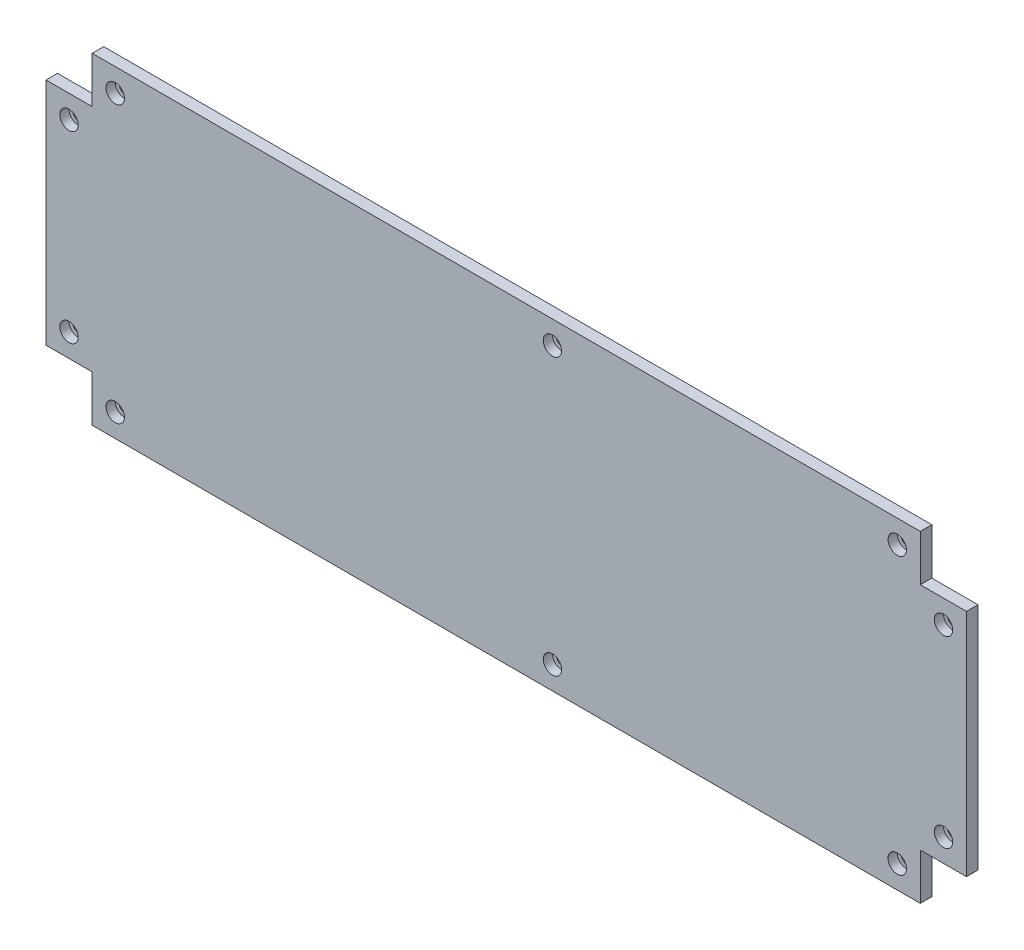
ISO-10303-21;
HEADER;
FILE_DESCRIPTION(('STEP AP214'),'2;1');
FILE_NAME('part.step','',(''),(''),'','','');
FILE_SCHEMA(('AUTOMOTIVE_DESIGN { 1 0 10303 214 1 1 1 1 }'));
ENDSEC;
DATA;
#1=APPLICATION_CONTEXT('core data for automotive mechanical design processes');
#2=APPLICATION_PROTOCOL_DEFINITION('international standard','automotive_design',2000,#1);
#3=PRODUCT_CONTEXT('',#1,'mechanical');
#4=PRODUCT('Part','Part','',(#3));
#5=PRODUCT_RELATED_PRODUCT_CATEGORY('part','',(#4));
#6=PRODUCT_DEFINITION_FORMATION('','',#4);
#7=PRODUCT_DEFINITION_CONTEXT('part definition',#1,'design');
#8=PRODUCT_DEFINITION('design','',#6,#7);
#9=PRODUCT_DEFINITION_SHAPE('','',#8);
#10=(LENGTH_UNIT() NAMED_UNIT(*) SI_UNIT(.MILLI.,.METRE.));
#11=(NAMED_UNIT(*) PLANE_ANGLE_UNIT() SI_UNIT($,.RADIAN.));
#12=(NAMED_UNIT(*) SI_UNIT($,.STERADIAN.) SOLID_ANGLE_UNIT());
#13=UNCERTAINTY_MEASURE_WITH_UNIT(LENGTH_MEASURE(1.E-05),#10,'distance_accuracy_value','');
#14=(GEOMETRIC_REPRESENTATION_CONTEXT(3) GLOBAL_UNCERTAINTY_ASSIGNED_CONTEXT((#13)) GLOBAL_UNIT_ASSIGNED_CONTEXT((#10,
#11,#12)) REPRESENTATION_CONTEXT('',''));
#15=CARTESIAN_POINT('',(0.,0.,0.));
#16=DIRECTION('',(0.,0.,1.));
#17=DIRECTION('',(1.,0.,0.));
#18=AXIS2_PLACEMENT_3D('',#15,#16,#17);
#19=CARTESIAN_POINT('',(-20.08,-99.84,5.));
#20=DIRECTION('',(1.,0.,0.));
#21=DIRECTION('',(0.,0.,-1.));
#22=AXIS2_PLACEMENT_3D('',#19,#20,#21);
#23=PLANE('',#22);
#24=DIRECTION('',(0.,-1.,0.));
#25=VECTOR('',#24,1.);
#26=CARTESIAN_POINT('',(-20.08,-99.84,0.));
#27=LINE('',#26,#25);
#28=CARTESIAN_POINT('',(-20.08,0.,0.));
#29=VERTEX_POINT('',#28);
#30=CARTESIAN_POINT('',(-20.08,-99.84,0.));
#31=VERTEX_POINT('',#30);
#32=EDGE_CURVE('E168',#29,#31,#27,.T.);
#33=ORIENTED_EDGE('',*,*,#32,.T.);
#34=DIRECTION('',(0.,0.,-1.));
#35=VECTOR('',#34,1.);
#36=CARTESIAN_POINT('',(-20.08,-99.84,5.));
#37=LINE('',#36,#35);
#38=CARTESIAN_POINT('',(-20.08,-99.84,5.));
#39=VERTEX_POINT('',#38);
#40=EDGE_CURVE('E11',#39,#31,#37,.T.);
#41=ORIENTED_EDGE('',*,*,#40,.F.);
#42=DIRECTION('',(0.,-1.,0.));
#43=VECTOR('',#42,1.);
#44=CARTESIAN_POINT('',(-20.08,-99.84,5.));
#45=LINE('',#44,#43);
#46=CARTESIAN_POINT('',(-20.08,0.,5.));
#47=VERTEX_POINT('',#46);
#48=EDGE_CURVE('E203',#47,#39,#45,.T.);
#49=ORIENTED_EDGE('',*,*,#48,.F.);
#50=DIRECTION('',(0.,0.,-1.));
#51=VECTOR('',#50,1.);
#52=CARTESIAN_POINT('',(-20.08,0.,5.));
#53=LINE('',#52,#51);
#54=EDGE_CURVE('E164',#47,#29,#53,.T.);
#55=ORIENTED_EDGE('',*,*,#54,.T.);
#56=EDGE_LOOP('',(#33,#41,#49,#55));
#57=FACE_BOUND('',#56,.T.);
#58=ADVANCED_FACE('F43',(#57),#23,.F.);
#59=CARTESIAN_POINT('',(0.,-99.84,5.));
#60=DIRECTION('',(0.,1.,0.));
#61=DIRECTION('',(0.,0.,1.));
#62=AXIS2_PLACEMENT_3D('',#59,#60,#61);
#63=PLANE('',#62);
#64=DIRECTION('',(1.,0.,0.));
#65=VECTOR('',#64,1.);
#66=CARTESIAN_POINT('',(0.,-99.84,0.));
#67=LINE('',#66,#65);
#68=CARTESIAN_POINT('',(0.,-99.84,0.));
#69=VERTEX_POINT('',#68);
#70=EDGE_CURVE('E172',#31,#69,#67,.T.);
#71=ORIENTED_EDGE('',*,*,#70,.T.);
#72=DIRECTION('',(0.,0.,-1.));
#73=VECTOR('',#72,1.);
#74=CARTESIAN_POINT('',(0.,-99.84,5.));
#75=LINE('',#74,#73);
#76=CARTESIAN_POINT('',(0.,-99.84,5.));
#77=VERTEX_POINT('',#76);
#78=EDGE_CURVE('E52',#77,#69,#75,.T.);
#79=ORIENTED_EDGE('',*,*,#78,.F.);
#80=DIRECTION('',(1.,0.,0.));
#81=VECTOR('',#80,1.);
#82=CARTESIAN_POINT('',(0.,-99.84,5.));
#83=LINE('',#82,#81);
#84=EDGE_CURVE('E115',#39,#77,#83,.T.);
#85=ORIENTED_EDGE('',*,*,#84,.F.);
#86=ORIENTED_EDGE('',*,*,#40,.T.);
#87=EDGE_LOOP('',(#71,#79,#85,#86));
#88=FACE_BOUND('',#87,.T.);
#89=ADVANCED_FACE('F298',(#88),#63,.F.);
#90=CARTESIAN_POINT('',(0.,-119.92,5.));
#91=DIRECTION('',(1.,0.,0.));
#92=DIRECTION('',(0.,1.,0.));
#93=AXIS2_PLACEMENT_3D('',#90,#91,#92);
#94=PLANE('',#93);
#95=DIRECTION('',(0.,-1.,0.));
#96=VECTOR('',#95,1.);
#97=CARTESIAN_POINT('',(0.,-119.92,0.));
#98=LINE('',#97,#96);
#99=CARTESIAN_POINT('',(0.,-119.92,0.));
#100=VERTEX_POINT('',#99);
#101=EDGE_CURVE('E176',#69,#100,#98,.T.);
#102=ORIENTED_EDGE('',*,*,#101,.T.);
#103=DIRECTION('',(0.,0.,-1.));
#104=VECTOR('',#103,1.);
#105=CARTESIAN_POINT('',(0.,-119.92,5.));
#106=LINE('',#105,#104);
#107=CARTESIAN_POINT('',(0.,-119.92,5.));
#108=VERTEX_POINT('',#107);
#109=EDGE_CURVE('E230',#108,#100,#106,.T.);
#110=ORIENTED_EDGE('',*,*,#109,.F.);
#111=DIRECTION('',(0.,-1.,0.));
#112=VECTOR('',#111,1.);
#113=CARTESIAN_POINT('',(0.,-119.92,5.));
#114=LINE('',#113,#112);
#115=EDGE_CURVE('E240',#77,#108,#114,.T.);
#116=ORIENTED_EDGE('',*,*,#115,.F.);
#117=ORIENTED_EDGE('',*,*,#78,.T.);
#118=EDGE_LOOP('',(#102,#110,#116,#117));
#119=FACE_BOUND('',#118,.T.);
#120=ADVANCED_FACE('F238',(#119),#94,.F.);
#121=CARTESIAN_POINT('',(359.84,-119.92,5.));
#122=DIRECTION('',(0.,1.,0.));
#123=DIRECTION('',(-1.,0.,0.));
#124=AXIS2_PLACEMENT_3D('',#121,#122,#123);
#125=PLANE('',#124);
#126=DIRECTION('',(1.,0.,0.));
#127=VECTOR('',#126,1.);
#128=CARTESIAN_POINT('',(359.84,-119.92,0.));
#129=LINE('',#128,#127);
#130=CARTESIAN_POINT('',(359.84,-119.92,0.));
#131=VERTEX_POINT('',#130);
#132=EDGE_CURVE('E179',#100,#131,#129,.T.);
#133=ORIENTED_EDGE('',*,*,#132,.T.);
#134=DIRECTION('',(0.,0.,-1.));
#135=VECTOR('',#134,1.);
#136=CARTESIAN_POINT('',(359.84,-119.92,5.));
#137=LINE('',#136,#135);
#138=CARTESIAN_POINT('',(359.84,-119.92,5.));
#139=VERTEX_POINT('',#138);
#140=EDGE_CURVE('E226',#139,#131,#137,.T.);
#141=ORIENTED_EDGE('',*,*,#140,.F.);
#142=DIRECTION('',(1.,0.,0.));
#143=VECTOR('',#142,1.);
#144=CARTESIAN_POINT('',(359.84,-119.92,5.));
#145=LINE('',#144,#143);
#146=EDGE_CURVE('E259',#108,#139,#145,.T.);
#147=ORIENTED_EDGE('',*,*,#146,.F.);
#148=ORIENTED_EDGE('',*,*,#109,.T.);
#149=EDGE_LOOP('',(#133,#141,#147,#148));
#150=FACE_BOUND('',#149,.T.);
#151=ADVANCED_FACE('F249',(#150),#125,.F.);
#152=CARTESIAN_POINT('',(359.84,-99.84,5.));
#153=DIRECTION('',(-1.,0.,0.));
#154=DIRECTION('',(0.,-1.,0.));
#155=AXIS2_PLACEMENT_3D('',#152,#153,#154);
#156=PLANE('',#155);
#157=DIRECTION('',(0.,1.,0.));
#158=VECTOR('',#157,1.);
#159=CARTESIAN_POINT('',(359.84,-99.84,0.));
#160=LINE('',#159,#158);
#161=CARTESIAN_POINT('',(359.84,-99.84,0.));
#162=VERTEX_POINT('',#161);
#163=EDGE_CURVE('E182',#131,#162,#160,.T.);
#164=ORIENTED_EDGE('',*,*,#163,.T.);
#165=DIRECTION('',(0.,0.,-1.));
#166=VECTOR('',#165,1.);
#167=CARTESIAN_POINT('',(359.84,-99.84,5.));
#168=LINE('',#167,#166);
#169=CARTESIAN_POINT('',(359.84,-99.84,5.));
#170=VERTEX_POINT('',#169);
#171=EDGE_CURVE('E222',#170,#162,#168,.T.);
#172=ORIENTED_EDGE('',*,*,#171,.F.);
#173=DIRECTION('',(0.,1.,0.));
#174=VECTOR('',#173,1.);
#175=CARTESIAN_POINT('',(359.84,-99.84,5.));
#176=LINE('',#175,#174);
#177=EDGE_CURVE('E255',#139,#170,#176,.T.);
#178=ORIENTED_EDGE('',*,*,#177,.F.);
#179=ORIENTED_EDGE('',*,*,#140,.T.);
#180=EDGE_LOOP('',(#164,#172,#178,#179));
#181=FACE_BOUND('',#180,.T.);
#182=ADVANCED_FACE('F253',(#181),#156,.F.);
#183=CARTESIAN_POINT('',(379.92,-99.84,5.));
#184=DIRECTION('',(0.,1.,0.));
#185=DIRECTION('',(0.,0.,1.));
#186=AXIS2_PLACEMENT_3D('',#183,#184,#185);
#187=PLANE('',#186);
#188=DIRECTION('',(1.,0.,0.));
#189=VECTOR('',#188,1.);
#190=CARTESIAN_POINT('',(379.92,-99.84,0.));
#191=LINE('',#190,#189);
#192=CARTESIAN_POINT('',(379.92,-99.84,0.));
#193=VERTEX_POINT('',#192);
#194=EDGE_CURVE('E185',#162,#193,#191,.T.);
#195=ORIENTED_EDGE('',*,*,#194,.T.);
#196=DIRECTION('',(0.,0.,-1.));
#197=VECTOR('',#196,1.);
#198=CARTESIAN_POINT('',(379.92,-99.84,5.));
#199=LINE('',#198,#197);
#200=CARTESIAN_POINT('',(379.92,-99.84,5.));
#201=VERTEX_POINT('',#200);
#202=EDGE_CURVE('E218',#201,#193,#199,.T.);
#203=ORIENTED_EDGE('',*,*,#202,.F.);
#204=DIRECTION('',(1.,0.,0.));
#205=VECTOR('',#204,1.);
#206=CARTESIAN_POINT('',(379.92,-99.84,5.));
#207=LINE('',#206,#205);
#208=EDGE_CURVE('E258',#170,#201,#207,.T.);
#209=ORIENTED_EDGE('',*,*,#208,.F.);
#210=ORIENTED_EDGE('',*,*,#171,.T.);
#211=EDGE_LOOP('',(#195,#203,#209,#210));
#212=FACE_BOUND('',#211,.T.);
#213=ADVANCED_FACE('F311',(#212),#187,.F.);
#214=CARTESIAN_POINT('',(379.92,0.,5.));
#215=DIRECTION('',(-1.,0.,0.));
#216=DIRECTION('',(0.,0.,1.));
#217=AXIS2_PLACEMENT_3D('',#214,#215,#216);
#218=PLANE('',#217);
#219=DIRECTION('',(0.,1.,0.));
#220=VECTOR('',#219,1.);
#221=CARTESIAN_POINT('',(379.92,0.,0.));
#222=LINE('',#221,#220);
#223=CARTESIAN_POINT('',(379.92,0.,0.));
#224=VERTEX_POINT('',#223);
#225=EDGE_CURVE('E188',#193,#224,#222,.T.);
#226=ORIENTED_EDGE('',*,*,#225,.T.);
#227=DIRECTION('',(0.,0.,-1.));
#228=VECTOR('',#227,1.);
#229=CARTESIAN_POINT('',(379.92,0.,5.));
#230=LINE('',#229,#228);
#231=CARTESIAN_POINT('',(379.92,0.,5.));
#232=VERTEX_POINT('',#231);
#233=EDGE_CURVE('E214',#232,#224,#230,.T.);
#234=ORIENTED_EDGE('',*,*,#233,.F.);
#235=DIRECTION('',(0.,1.,0.));
#236=VECTOR('',#235,1.);
#237=CARTESIAN_POINT('',(379.92,0.,5.));
#238=LINE('',#237,#236);
#239=EDGE_CURVE('E263',#201,#232,#238,.T.);
#240=ORIENTED_EDGE('',*,*,#239,.F.);
#241=ORIENTED_EDGE('',*,*,#202,.T.);
#242=EDGE_LOOP('',(#226,#234,#240,#241));
#243=FACE_BOUND('',#242,.T.);
#244=ADVANCED_FACE('F314',(#243),#218,.F.);
#245=CARTESIAN_POINT('',(359.84,0.,5.));
#246=DIRECTION('',(0.,-1.,0.));
#247=DIRECTION('',(0.,0.,-1.));
#248=AXIS2_PLACEMENT_3D('',#245,#246,#247);
#249=PLANE('',#248);
#250=DIRECTION('',(-1.,0.,0.));
#251=VECTOR('',#250,1.);
#252=CARTESIAN_POINT('',(359.84,0.,0.));
#253=LINE('',#252,#251);
#254=CARTESIAN_POINT('',(359.84,0.,0.));
#255=VERTEX_POINT('',#254);
#256=EDGE_CURVE('E191',#224,#255,#253,.T.);
#257=ORIENTED_EDGE('',*,*,#256,.T.);
#258=DIRECTION('',(0.,0.,-1.));
#259=VECTOR('',#258,1.);
#260=CARTESIAN_POINT('',(359.84,0.,5.));
#261=LINE('',#260,#259);
#262=CARTESIAN_POINT('',(359.84,0.,5.));
#263=VERTEX_POINT('',#262);
#264=EDGE_CURVE('E210',#263,#255,#261,.T.);
#265=ORIENTED_EDGE('',*,*,#264,.F.);
#266=DIRECTION('',(-1.,0.,0.));
#267=VECTOR('',#266,1.);
#268=CARTESIAN_POINT('',(359.84,0.,5.));
#269=LINE('',#268,#267);
#270=EDGE_CURVE('E270',#232,#263,#269,.T.);
#271=ORIENTED_EDGE('',*,*,#270,.F.);
#272=ORIENTED_EDGE('',*,*,#233,.T.);
#273=EDGE_LOOP('',(#257,#265,#271,#272));
#274=FACE_BOUND('',#273,.T.);
#275=ADVANCED_FACE('F278',(#274),#249,.F.);
#276=CARTESIAN_POINT('',(359.84,20.08,5.));
#277=DIRECTION('',(-1.,0.,0.));
#278=DIRECTION('',(0.,0.,1.));
#279=AXIS2_PLACEMENT_3D('',#276,#277,#278);
#280=PLANE('',#279);
#281=DIRECTION('',(0.,1.,0.));
#282=VECTOR('',#281,1.);
#283=CARTESIAN_POINT('',(359.84,20.08,0.));
#284=LINE('',#283,#282);
#285=CARTESIAN_POINT('',(359.84,20.08,0.));
#286=VERTEX_POINT('',#285);
#287=EDGE_CURVE('E194',#255,#286,#284,.T.);
#288=ORIENTED_EDGE('',*,*,#287,.T.);
#289=DIRECTION('',(0.,0.,-1.));
#290=VECTOR('',#289,1.);
#291=CARTESIAN_POINT('',(359.84,20.08,5.));
#292=LINE('',#291,#290);
#293=CARTESIAN_POINT('',(359.84,20.08,5.));
#294=VERTEX_POINT('',#293);
#295=EDGE_CURVE('E157',#294,#286,#292,.T.);
#296=ORIENTED_EDGE('',*,*,#295,.F.);
#297=DIRECTION('',(0.,1.,0.));
#298=VECTOR('',#297,1.);
#299=CARTESIAN_POINT('',(359.84,20.08,5.));
#300=LINE('',#299,#298);
#301=EDGE_CURVE('E146',#263,#294,#300,.T.);
#302=ORIENTED_EDGE('',*,*,#301,.F.);
#303=ORIENTED_EDGE('',*,*,#264,.T.);
#304=EDGE_LOOP('',(#288,#296,#302,#303));
#305=FACE_BOUND('',#304,.T.);
#306=ADVANCED_FACE('F282',(#305),#280,.F.);
#307=CARTESIAN_POINT('',(0.,20.08,5.));
#308=DIRECTION('',(0.,-1.,0.));
#309=DIRECTION('',(0.,0.,-1.));
#310=AXIS2_PLACEMENT_3D('',#307,#308,#309);
#311=PLANE('',#310);
#312=DIRECTION('',(-1.,0.,0.));
#313=VECTOR('',#312,1.);
#314=CARTESIAN_POINT('',(0.,20.08,0.));
#315=LINE('',#314,#313);
#316=CARTESIAN_POINT('',(0.,20.08,0.));
#317=VERTEX_POINT('',#316);
#318=EDGE_CURVE('E155',#286,#317,#315,.T.);
#319=ORIENTED_EDGE('',*,*,#318,.T.);
#320=DIRECTION('',(0.,0.,-1.));
#321=VECTOR('',#320,1.);
#322=CARTESIAN_POINT('',(0.,20.08,5.));
#323=LINE('',#322,#321);
#324=CARTESIAN_POINT('',(0.,20.08,5.));
#325=VERTEX_POINT('',#324);
#326=EDGE_CURVE('E152',#325,#317,#323,.T.);
#327=ORIENTED_EDGE('',*,*,#326,.F.);
#328=DIRECTION('',(-1.,0.,0.));
#329=VECTOR('',#328,1.);
#330=CARTESIAN_POINT('',(0.,20.08,5.));
#331=LINE('',#330,#329);
#332=EDGE_CURVE('E140',#294,#325,#331,.T.);
#333=ORIENTED_EDGE('',*,*,#332,.F.);
#334=ORIENTED_EDGE('',*,*,#295,.T.);
#335=EDGE_LOOP('',(#319,#327,#333,#334));
#336=FACE_BOUND('',#335,.T.);
#337=ADVANCED_FACE('F153',(#336),#311,.F.);
#338=CARTESIAN_POINT('',(0.,0.,5.));
#339=DIRECTION('',(1.,0.,0.));
#340=DIRECTION('',(0.,0.,-1.));
#341=AXIS2_PLACEMENT_3D('',#338,#339,#340);
#342=PLANE('',#341);
#343=DIRECTION('',(0.,-1.,0.));
#344=VECTOR('',#343,1.);
#345=CARTESIAN_POINT('',(0.,0.,0.));
#346=LINE('',#345,#344);
#347=CARTESIAN_POINT('',(0.,0.,0.));
#348=VERTEX_POINT('',#347);
#349=EDGE_CURVE('E101',#317,#348,#346,.T.);
#350=ORIENTED_EDGE('',*,*,#349,.T.);
#351=DIRECTION('',(0.,0.,-1.));
#352=VECTOR('',#351,1.);
#353=CARTESIAN_POINT('',(0.,0.,5.));
#354=LINE('',#353,#352);
#355=CARTESIAN_POINT('',(0.,0.,5.));
#356=VERTEX_POINT('',#355);
#357=EDGE_CURVE('E158',#356,#348,#354,.T.);
#358=ORIENTED_EDGE('',*,*,#357,.F.);
#359=DIRECTION('',(0.,-1.,0.));
#360=VECTOR('',#359,1.);
#361=CARTESIAN_POINT('',(0.,0.,5.));
#362=LINE('',#361,#360);
#363=EDGE_CURVE('E144',#325,#356,#362,.T.);
#364=ORIENTED_EDGE('',*,*,#363,.F.);
#365=ORIENTED_EDGE('',*,*,#326,.T.);
#366=EDGE_LOOP('',(#350,#358,#364,#365));
#367=FACE_BOUND('',#366,.T.);
#368=ADVANCED_FACE('F160',(#367),#342,.F.);
#369=CARTESIAN_POINT('',(-20.08,0.,5.));
#370=DIRECTION('',(0.,-1.,0.));
#371=DIRECTION('',(0.,0.,-1.));
#372=AXIS2_PLACEMENT_3D('',#369,#370,#371);
#373=PLANE('',#372);
#374=DIRECTION('',(-1.,0.,0.));
#375=VECTOR('',#374,1.);
#376=CARTESIAN_POINT('',(-20.08,0.,0.));
#377=LINE('',#376,#375);
#378=EDGE_CURVE('E107',#348,#29,#377,.T.);
#379=ORIENTED_EDGE('',*,*,#378,.T.);
#380=ORIENTED_EDGE('',*,*,#54,.F.);
#381=DIRECTION('',(-1.,0.,0.));
#382=VECTOR('',#381,1.);
#383=CARTESIAN_POINT('',(-20.08,0.,5.));
#384=LINE('',#383,#382);
#385=EDGE_CURVE('E60',#356,#47,#384,.T.);
#386=ORIENTED_EDGE('',*,*,#385,.F.);
#387=ORIENTED_EDGE('',*,*,#357,.T.);
#388=EDGE_LOOP('',(#379,#380,#386,#387));
#389=FACE_BOUND('',#388,.T.);
#390=ADVANCED_FACE('F286',(#389),#373,.F.);
#391=CARTESIAN_POINT('',(0.,0.,5.));
#392=DIRECTION('',(0.,0.,-1.));
#393=DIRECTION('',(-1.,0.,0.));
#394=AXIS2_PLACEMENT_3D('',#391,#392,#393);
#395=PLANE('',#394);
#396=CARTESIAN_POINT('',(-10.08,-10.,5.));
#397=DIRECTION('',(0.,0.,1.));
#398=DIRECTION('',(1.,0.,0.));
#399=AXIS2_PLACEMENT_3D('',#396,#397,#398);
#400=CIRCLE('',#399,4.);
#401=CARTESIAN_POINT('',(-6.08,-10.,5.));
#402=VERTEX_POINT('',#401);
#403=EDGE_CURVE('E798',#402,#402,#400,.T.);
#404=ORIENTED_EDGE('',*,*,#403,.F.);
#405=EDGE_LOOP('',(#404));
#406=FACE_BOUND('',#405,.T.);
#407=CARTESIAN_POINT('',(-10.08,-89.84,5.));
#408=DIRECTION('',(0.,0.,1.));
#409=DIRECTION('',(1.,0.,0.));
#410=AXIS2_PLACEMENT_3D('',#407,#408,#409);
#411=CIRCLE('',#410,4.);
#412=CARTESIAN_POINT('',(-6.08,-89.84,5.));
#413=VERTEX_POINT('',#412);
#414=EDGE_CURVE('E812',#413,#413,#411,.T.);
#415=ORIENTED_EDGE('',*,*,#414,.F.);
#416=EDGE_LOOP('',(#415));
#417=FACE_BOUND('',#416,.T.);
#418=CARTESIAN_POINT('',(10.,-109.92,5.));
#419=DIRECTION('',(0.,0.,1.));
#420=DIRECTION('',(1.,0.,0.));
#421=AXIS2_PLACEMENT_3D('',#418,#419,#420);
#422=CIRCLE('',#421,4.);
#423=CARTESIAN_POINT('',(14.,-109.92,5.));
#424=VERTEX_POINT('',#423);
#425=EDGE_CURVE('E828',#424,#424,#422,.T.);
#426=ORIENTED_EDGE('',*,*,#425,.F.);
#427=EDGE_LOOP('',(#426));
#428=FACE_BOUND('',#427,.T.);
#429=CARTESIAN_POINT('',(200.,-109.92,5.));
#430=DIRECTION('',(0.,0.,1.));
#431=DIRECTION('',(1.,0.,0.));
#432=AXIS2_PLACEMENT_3D('',#429,#430,#431);
#433=CIRCLE('',#432,4.);
#434=CARTESIAN_POINT('',(204.,-109.92,5.));
#435=VERTEX_POINT('',#434);
#436=EDGE_CURVE('E844',#435,#435,#433,.T.);
#437=ORIENTED_EDGE('',*,*,#436,.F.);
#438=EDGE_LOOP('',(#437));
#439=FACE_BOUND('',#438,.T.);
#440=CARTESIAN_POINT('',(349.84,-109.92,5.));
#441=DIRECTION('',(0.,0.,1.));
#442=DIRECTION('',(1.,0.,0.));
#443=AXIS2_PLACEMENT_3D('',#440,#441,#442);
#444=CIRCLE('',#443,4.);
#445=CARTESIAN_POINT('',(353.84,-109.92,5.));
#446=VERTEX_POINT('',#445);
#447=EDGE_CURVE('E860',#446,#446,#444,.T.);
#448=ORIENTED_EDGE('',*,*,#447,.F.);
#449=EDGE_LOOP('',(#448));
#450=FACE_BOUND('',#449,.T.);
#451=CARTESIAN_POINT('',(369.92,-89.84,5.));
#452=DIRECTION('',(0.,0.,1.));
#453=DIRECTION('',(1.,0.,0.));
#454=AXIS2_PLACEMENT_3D('',#451,#452,#453);
#455=CIRCLE('',#454,4.);
#456=CARTESIAN_POINT('',(373.92,-89.84,5.));
#457=VERTEX_POINT('',#456);
#458=EDGE_CURVE('E876',#457,#457,#455,.T.);
#459=ORIENTED_EDGE('',*,*,#458,.F.);
#460=EDGE_LOOP('',(#459));
#461=FACE_BOUND('',#460,.T.);
#462=CARTESIAN_POINT('',(369.92,-9.99999999999999,5.));
#463=DIRECTION('',(0.,0.,1.));
#464=DIRECTION('',(1.,0.,0.));
#465=AXIS2_PLACEMENT_3D('',#462,#463,#464);
#466=CIRCLE('',#465,4.);
#467=CARTESIAN_POINT('',(373.92,-9.99999999999999,5.));
#468=VERTEX_POINT('',#467);
#469=EDGE_CURVE('E892',#468,#468,#466,.T.);
#470=ORIENTED_EDGE('',*,*,#469,.F.);
#471=EDGE_LOOP('',(#470));
#472=FACE_BOUND('',#471,.T.);
#473=CARTESIAN_POINT('',(349.84,10.08,5.));
#474=DIRECTION('',(0.,0.,1.));
#475=DIRECTION('',(1.,0.,0.));
#476=AXIS2_PLACEMENT_3D('',#473,#474,#475);
#477=CIRCLE('',#476,4.);
#478=CARTESIAN_POINT('',(353.84,10.08,5.));
#479=VERTEX_POINT('',#478);
#480=EDGE_CURVE('E908',#479,#479,#477,.T.);
#481=ORIENTED_EDGE('',*,*,#480,.F.);
#482=EDGE_LOOP('',(#481));
#483=FACE_BOUND('',#482,.T.);
#484=CARTESIAN_POINT('',(200.,10.08,5.));
#485=DIRECTION('',(0.,0.,1.));
#486=DIRECTION('',(1.,0.,0.));
#487=AXIS2_PLACEMENT_3D('',#484,#485,#486);
#488=CIRCLE('',#487,4.);
#489=CARTESIAN_POINT('',(204.,10.08,5.));
#490=VERTEX_POINT('',#489);
#491=EDGE_CURVE('E924',#490,#490,#488,.T.);
#492=ORIENTED_EDGE('',*,*,#491,.F.);
#493=EDGE_LOOP('',(#492));
#494=FACE_BOUND('',#493,.T.);
#495=CARTESIAN_POINT('',(10.,10.08,5.));
#496=DIRECTION('',(0.,0.,1.));
#497=DIRECTION('',(1.,0.,0.));
#498=AXIS2_PLACEMENT_3D('',#495,#496,#497);
#499=CIRCLE('',#498,4.);
#500=CARTESIAN_POINT('',(14.,10.08,5.));
#501=VERTEX_POINT('',#500);
#502=EDGE_CURVE('E940',#501,#501,#499,.T.);
#503=ORIENTED_EDGE('',*,*,#502,.F.);
#504=EDGE_LOOP('',(#503));
#505=FACE_BOUND('',#504,.T.);
#506=ORIENTED_EDGE('',*,*,#48,.T.);
#507=ORIENTED_EDGE('',*,*,#84,.T.);
#508=ORIENTED_EDGE('',*,*,#115,.T.);
#509=ORIENTED_EDGE('',*,*,#146,.T.);
#510=ORIENTED_EDGE('',*,*,#177,.T.);
#511=ORIENTED_EDGE('',*,*,#208,.T.);
#512=ORIENTED_EDGE('',*,*,#239,.T.);
#513=ORIENTED_EDGE('',*,*,#270,.T.);
#514=ORIENTED_EDGE('',*,*,#301,.T.);
#515=ORIENTED_EDGE('',*,*,#332,.T.);
#516=ORIENTED_EDGE('',*,*,#363,.T.);
#517=ORIENTED_EDGE('',*,*,#385,.T.);
#518=EDGE_LOOP('',(#506,#507,#508,#509,#510,#511,#512,#513,#514,#515,#516,#517));
#519=FACE_BOUND('',#518,.T.);
#520=ADVANCED_FACE('F142',(#406,#417,#428,#439,#450,#461,#472,#483,#494,#505,#519),#395,.F.);
#521=CARTESIAN_POINT('',(0.,0.,0.));
#522=DIRECTION('',(0.,0.,-1.));
#523=DIRECTION('',(-1.,0.,0.));
#524=AXIS2_PLACEMENT_3D('',#521,#522,#523);
#525=PLANE('',#524);
#526=CARTESIAN_POINT('',(-10.08,-10.,0.));
#527=DIRECTION('',(0.,0.,1.));
#528=DIRECTION('',(1.,0.,0.));
#529=AXIS2_PLACEMENT_3D('',#526,#527,#528);
#530=CIRCLE('',#529,2.25);
#531=CARTESIAN_POINT('',(-7.83,-10.,0.));
#532=VERTEX_POINT('',#531);
#533=EDGE_CURVE('E808',#532,#532,#530,.T.);
#534=ORIENTED_EDGE('',*,*,#533,.T.);
#535=EDGE_LOOP('',(#534));
#536=FACE_BOUND('',#535,.T.);
#537=CARTESIAN_POINT('',(-10.08,-89.84,0.));
#538=DIRECTION('',(0.,0.,1.));
#539=DIRECTION('',(1.,0.,0.));
#540=AXIS2_PLACEMENT_3D('',#537,#538,#539);
#541=CIRCLE('',#540,2.25);
#542=CARTESIAN_POINT('',(-7.83,-89.84,0.));
#543=VERTEX_POINT('',#542);
#544=EDGE_CURVE('E824',#543,#543,#541,.T.);
#545=ORIENTED_EDGE('',*,*,#544,.T.);
#546=EDGE_LOOP('',(#545));
#547=FACE_BOUND('',#546,.T.);
#548=CARTESIAN_POINT('',(10.,-109.92,0.));
#549=DIRECTION('',(0.,0.,1.));
#550=DIRECTION('',(1.,0.,0.));
#551=AXIS2_PLACEMENT_3D('',#548,#549,#550);
#552=CIRCLE('',#551,2.25);
#553=CARTESIAN_POINT('',(12.25,-109.92,0.));
#554=VERTEX_POINT('',#553);
#555=EDGE_CURVE('E840',#554,#554,#552,.T.);
#556=ORIENTED_EDGE('',*,*,#555,.T.);
#557=EDGE_LOOP('',(#556));
#558=FACE_BOUND('',#557,.T.);
#559=CARTESIAN_POINT('',(200.,-109.92,0.));
#560=DIRECTION('',(0.,0.,1.));
#561=DIRECTION('',(1.,0.,0.));
#562=AXIS2_PLACEMENT_3D('',#559,#560,#561);
#563=CIRCLE('',#562,2.25);
#564=CARTESIAN_POINT('',(202.25,-109.92,0.));
#565=VERTEX_POINT('',#564);
#566=EDGE_CURVE('E856',#565,#565,#563,.T.);
#567=ORIENTED_EDGE('',*,*,#566,.T.);
#568=EDGE_LOOP('',(#567));
#569=FACE_BOUND('',#568,.T.);
#570=CARTESIAN_POINT('',(349.84,-109.92,0.));
#571=DIRECTION('',(0.,0.,1.));
#572=DIRECTION('',(1.,0.,0.));
#573=AXIS2_PLACEMENT_3D('',#570,#571,#572);
#574=CIRCLE('',#573,2.24999999999997);
#575=CARTESIAN_POINT('',(352.09,-109.92,0.));
#576=VERTEX_POINT('',#575);
#577=EDGE_CURVE('E872',#576,#576,#574,.T.);
#578=ORIENTED_EDGE('',*,*,#577,.T.);
#579=EDGE_LOOP('',(#578));
#580=FACE_BOUND('',#579,.T.);
#581=CARTESIAN_POINT('',(369.92,-89.84,0.));
#582=DIRECTION('',(0.,0.,1.));
#583=DIRECTION('',(1.,0.,0.));
#584=AXIS2_PLACEMENT_3D('',#581,#582,#583);
#585=CIRCLE('',#584,2.24999999999997);
#586=CARTESIAN_POINT('',(372.17,-89.84,0.));
#587=VERTEX_POINT('',#586);
#588=EDGE_CURVE('E888',#587,#587,#585,.T.);
#589=ORIENTED_EDGE('',*,*,#588,.T.);
#590=EDGE_LOOP('',(#589));
#591=FACE_BOUND('',#590,.T.);
#592=CARTESIAN_POINT('',(369.92,-9.99999999999999,0.));
#593=DIRECTION('',(0.,0.,1.));
#594=DIRECTION('',(1.,0.,0.));
#595=AXIS2_PLACEMENT_3D('',#592,#593,#594);
#596=CIRCLE('',#595,2.24999999999997);
#597=CARTESIAN_POINT('',(372.17,-9.99999999999999,0.));
#598=VERTEX_POINT('',#597);
#599=EDGE_CURVE('E904',#598,#598,#596,.T.);
#600=ORIENTED_EDGE('',*,*,#599,.T.);
#601=EDGE_LOOP('',(#600));
#602=FACE_BOUND('',#601,.T.);
#603=CARTESIAN_POINT('',(349.84,10.08,0.));
#604=DIRECTION('',(0.,0.,1.));
#605=DIRECTION('',(1.,0.,0.));
#606=AXIS2_PLACEMENT_3D('',#603,#604,#605);
#607=CIRCLE('',#606,2.24999999999997);
#608=CARTESIAN_POINT('',(352.09,10.08,0.));
#609=VERTEX_POINT('',#608);
#610=EDGE_CURVE('E920',#609,#609,#607,.T.);
#611=ORIENTED_EDGE('',*,*,#610,.T.);
#612=EDGE_LOOP('',(#611));
#613=FACE_BOUND('',#612,.T.);
#614=CARTESIAN_POINT('',(200.,10.08,0.));
#615=DIRECTION('',(0.,0.,1.));
#616=DIRECTION('',(1.,0.,0.));
#617=AXIS2_PLACEMENT_3D('',#614,#615,#616);
#618=CIRCLE('',#617,2.25);
#619=CARTESIAN_POINT('',(202.25,10.08,0.));
#620=VERTEX_POINT('',#619);
#621=EDGE_CURVE('E936',#620,#620,#618,.T.);
#622=ORIENTED_EDGE('',*,*,#621,.T.);
#623=EDGE_LOOP('',(#622));
#624=FACE_BOUND('',#623,.T.);
#625=CARTESIAN_POINT('',(10.,10.08,0.));
#626=DIRECTION('',(0.,0.,1.));
#627=DIRECTION('',(1.,0.,0.));
#628=AXIS2_PLACEMENT_3D('',#625,#626,#627);
#629=CIRCLE('',#628,2.25);
#630=CARTESIAN_POINT('',(12.25,10.08,0.));
#631=VERTEX_POINT('',#630);
#632=EDGE_CURVE('E173',#631,#631,#629,.T.);
#633=ORIENTED_EDGE('',*,*,#632,.T.);
#634=EDGE_LOOP('',(#633));
#635=FACE_BOUND('',#634,.T.);
#636=ORIENTED_EDGE('',*,*,#32,.F.);
#637=ORIENTED_EDGE('',*,*,#378,.F.);
#638=ORIENTED_EDGE('',*,*,#349,.F.);
#639=ORIENTED_EDGE('',*,*,#318,.F.);
#640=ORIENTED_EDGE('',*,*,#287,.F.);
#641=ORIENTED_EDGE('',*,*,#256,.F.);
#642=ORIENTED_EDGE('',*,*,#225,.F.);
#643=ORIENTED_EDGE('',*,*,#194,.F.);
#644=ORIENTED_EDGE('',*,*,#163,.F.);
#645=ORIENTED_EDGE('',*,*,#132,.F.);
#646=ORIENTED_EDGE('',*,*,#101,.F.);
#647=ORIENTED_EDGE('',*,*,#70,.F.);
#648=EDGE_LOOP('',(#636,#637,#638,#639,#640,#641,#642,#643,#644,#645,#646,#647));
#649=FACE_BOUND('',#648,.T.);
#650=ADVANCED_FACE('F244',(#536,#547,#558,#569,#580,#591,#602,#613,#624,#635,#649),#525,.T.);
#651=CARTESIAN_POINT('',(10.,10.08,5.));
#652=DIRECTION('',(0.,0.,1.));
#653=DIRECTION('',(1.,0.,0.));
#654=AXIS2_PLACEMENT_3D('',#651,#652,#653);
#655=CYLINDRICAL_SURFACE('',#654,2.25);
#656=ORIENTED_EDGE('',*,*,#632,.F.);
#657=EDGE_LOOP('',(#656));
#658=FACE_BOUND('',#657,.T.);
#659=CARTESIAN_POINT('',(10.,10.08,1.));
#660=DIRECTION('',(0.,0.,1.));
#661=DIRECTION('',(1.,0.,0.));
#662=AXIS2_PLACEMENT_3D('',#659,#660,#661);
#663=CIRCLE('',#662,2.25);
#664=CARTESIAN_POINT('',(12.25,10.08,1.));
#665=VERTEX_POINT('',#664);
#666=EDGE_CURVE('E948',#665,#665,#663,.T.);
#667=ORIENTED_EDGE('',*,*,#666,.T.);
#668=EDGE_LOOP('',(#667));
#669=FACE_BOUND('',#668,.T.);
#670=ADVANCED_FACE('F354',(#658,#669),#655,.F.);
#671=CARTESIAN_POINT('',(12.25,10.08,1.));
#672=DIRECTION('',(0.,0.,-1.));
#673=DIRECTION('',(-1.,0.,0.));
#674=AXIS2_PLACEMENT_3D('',#671,#672,#673);
#675=PLANE('',#674);
#676=ORIENTED_EDGE('',*,*,#666,.F.);
#677=EDGE_LOOP('',(#676));
#678=FACE_BOUND('',#677,.T.);
#679=CARTESIAN_POINT('',(10.,10.08,1.));
#680=DIRECTION('',(0.,0.,1.));
#681=DIRECTION('',(1.,0.,0.));
#682=AXIS2_PLACEMENT_3D('',#679,#680,#681);
#683=CIRCLE('',#682,4.);
#684=CARTESIAN_POINT('',(14.,10.08,1.));
#685=VERTEX_POINT('',#684);
#686=EDGE_CURVE('E944',#685,#685,#683,.T.);
#687=ORIENTED_EDGE('',*,*,#686,.T.);
#688=EDGE_LOOP('',(#687));
#689=FACE_BOUND('',#688,.T.);
#690=ADVANCED_FACE('F364',(#678,#689),#675,.F.);
#691=CARTESIAN_POINT('',(10.,10.08,5.));
#692=DIRECTION('',(0.,0.,1.));
#693=DIRECTION('',(1.,0.,0.));
#694=AXIS2_PLACEMENT_3D('',#691,#692,#693);
#695=CYLINDRICAL_SURFACE('',#694,4.);
#696=ORIENTED_EDGE('',*,*,#686,.F.);
#697=EDGE_LOOP('',(#696));
#698=FACE_BOUND('',#697,.T.);
#699=ORIENTED_EDGE('',*,*,#502,.T.);
#700=EDGE_LOOP('',(#699));
#701=FACE_BOUND('',#700,.T.);
#702=ADVANCED_FACE('F375',(#698,#701),#695,.F.);
#703=CARTESIAN_POINT('',(200.,10.08,5.));
#704=DIRECTION('',(0.,0.,1.));
#705=DIRECTION('',(1.,0.,0.));
#706=AXIS2_PLACEMENT_3D('',#703,#704,#705);
#707=CYLINDRICAL_SURFACE('',#706,2.25);
#708=ORIENTED_EDGE('',*,*,#621,.F.);
#709=EDGE_LOOP('',(#708));
#710=FACE_BOUND('',#709,.T.);
#711=CARTESIAN_POINT('',(200.,10.08,1.));
#712=DIRECTION('',(0.,0.,1.));
#713=DIRECTION('',(1.,0.,0.));
#714=AXIS2_PLACEMENT_3D('',#711,#712,#713);
#715=CIRCLE('',#714,2.25);
#716=CARTESIAN_POINT('',(202.25,10.08,1.));
#717=VERTEX_POINT('',#716);
#718=EDGE_CURVE('E932',#717,#717,#715,.T.);
#719=ORIENTED_EDGE('',*,*,#718,.T.);
#720=EDGE_LOOP('',(#719));
#721=FACE_BOUND('',#720,.T.);
#722=ADVANCED_FACE('F386',(#710,#721),#707,.F.);
#723=CARTESIAN_POINT('',(202.25,10.08,1.));
#724=DIRECTION('',(0.,0.,-1.));
#725=DIRECTION('',(-1.,0.,0.));
#726=AXIS2_PLACEMENT_3D('',#723,#724,#725);
#727=PLANE('',#726);
#728=ORIENTED_EDGE('',*,*,#718,.F.);
#729=EDGE_LOOP('',(#728));
#730=FACE_BOUND('',#729,.T.);
#731=CARTESIAN_POINT('',(200.,10.08,1.));
#732=DIRECTION('',(0.,0.,1.));
#733=DIRECTION('',(1.,0.,0.));
#734=AXIS2_PLACEMENT_3D('',#731,#732,#733);
#735=CIRCLE('',#734,4.);
#736=CARTESIAN_POINT('',(204.,10.08,1.));
#737=VERTEX_POINT('',#736);
#738=EDGE_CURVE('E928',#737,#737,#735,.T.);
#739=ORIENTED_EDGE('',*,*,#738,.T.);
#740=EDGE_LOOP('',(#739));
#741=FACE_BOUND('',#740,.T.);
#742=ADVANCED_FACE('F397',(#730,#741),#727,.F.);
#743=CARTESIAN_POINT('',(200.,10.08,5.));
#744=DIRECTION('',(0.,0.,1.));
#745=DIRECTION('',(1.,0.,0.));
#746=AXIS2_PLACEMENT_3D('',#743,#744,#745);
#747=CYLINDRICAL_SURFACE('',#746,4.);
#748=ORIENTED_EDGE('',*,*,#738,.F.);
#749=EDGE_LOOP('',(#748));
#750=FACE_BOUND('',#749,.T.);
#751=ORIENTED_EDGE('',*,*,#491,.T.);
#752=EDGE_LOOP('',(#751));
#753=FACE_BOUND('',#752,.T.);
#754=ADVANCED_FACE('F408',(#750,#753),#747,.F.);
#755=CARTESIAN_POINT('',(349.84,10.08,5.));
#756=DIRECTION('',(0.,0.,1.));
#757=DIRECTION('',(1.,0.,0.));
#758=AXIS2_PLACEMENT_3D('',#755,#756,#757);
#759=CYLINDRICAL_SURFACE('',#758,2.24999999999997);
#760=ORIENTED_EDGE('',*,*,#610,.F.);
#761=EDGE_LOOP('',(#760));
#762=FACE_BOUND('',#761,.T.);
#763=CARTESIAN_POINT('',(349.84,10.08,1.));
#764=DIRECTION('',(0.,0.,1.));
#765=DIRECTION('',(1.,0.,0.));
#766=AXIS2_PLACEMENT_3D('',#763,#764,#765);
#767=CIRCLE('',#766,2.24999999999997);
#768=CARTESIAN_POINT('',(352.09,10.08,1.));
#769=VERTEX_POINT('',#768);
#770=EDGE_CURVE('E916',#769,#769,#767,.T.);
#771=ORIENTED_EDGE('',*,*,#770,.T.);
#772=EDGE_LOOP('',(#771));
#773=FACE_BOUND('',#772,.T.);
#774=ADVANCED_FACE('F419',(#762,#773),#759,.F.);
#775=CARTESIAN_POINT('',(352.09,10.08,1.));
#776=DIRECTION('',(0.,0.,-1.));
#777=DIRECTION('',(-1.,0.,0.));
#778=AXIS2_PLACEMENT_3D('',#775,#776,#777);
#779=PLANE('',#778);
#780=ORIENTED_EDGE('',*,*,#770,.F.);
#781=EDGE_LOOP('',(#780));
#782=FACE_BOUND('',#781,.T.);
#783=CARTESIAN_POINT('',(349.84,10.08,1.));
#784=DIRECTION('',(0.,0.,1.));
#785=DIRECTION('',(1.,0.,0.));
#786=AXIS2_PLACEMENT_3D('',#783,#784,#785);
#787=CIRCLE('',#786,4.);
#788=CARTESIAN_POINT('',(353.84,10.08,1.));
#789=VERTEX_POINT('',#788);
#790=EDGE_CURVE('E912',#789,#789,#787,.T.);
#791=ORIENTED_EDGE('',*,*,#790,.T.);
#792=EDGE_LOOP('',(#791));
#793=FACE_BOUND('',#792,.T.);
#794=ADVANCED_FACE('F430',(#782,#793),#779,.F.);
#795=CARTESIAN_POINT('',(349.84,10.08,5.));
#796=DIRECTION('',(0.,0.,1.));
#797=DIRECTION('',(1.,0.,0.));
#798=AXIS2_PLACEMENT_3D('',#795,#796,#797);
#799=CYLINDRICAL_SURFACE('',#798,4.);
#800=ORIENTED_EDGE('',*,*,#790,.F.);
#801=EDGE_LOOP('',(#800));
#802=FACE_BOUND('',#801,.T.);
#803=ORIENTED_EDGE('',*,*,#480,.T.);
#804=EDGE_LOOP('',(#803));
#805=FACE_BOUND('',#804,.T.);
#806=ADVANCED_FACE('F441',(#802,#805),#799,.F.);
#807=CARTESIAN_POINT('',(369.92,-9.99999999999999,5.));
#808=DIRECTION('',(0.,0.,1.));
#809=DIRECTION('',(1.,0.,0.));
#810=AXIS2_PLACEMENT_3D('',#807,#808,#809);
#811=CYLINDRICAL_SURFACE('',#810,2.24999999999997);
#812=ORIENTED_EDGE('',*,*,#599,.F.);
#813=EDGE_LOOP('',(#812));
#814=FACE_BOUND('',#813,.T.);
#815=CARTESIAN_POINT('',(369.92,-9.99999999999999,1.));
#816=DIRECTION('',(0.,0.,1.));
#817=DIRECTION('',(1.,0.,0.));
#818=AXIS2_PLACEMENT_3D('',#815,#816,#817);
#819=CIRCLE('',#818,2.24999999999997);
#820=CARTESIAN_POINT('',(372.17,-9.99999999999999,1.));
#821=VERTEX_POINT('',#820);
#822=EDGE_CURVE('E900',#821,#821,#819,.T.);
#823=ORIENTED_EDGE('',*,*,#822,.T.);
#824=EDGE_LOOP('',(#823));
#825=FACE_BOUND('',#824,.T.);
#826=ADVANCED_FACE('F452',(#814,#825),#811,.F.);
#827=CARTESIAN_POINT('',(372.17,-9.99999999999999,1.));
#828=DIRECTION('',(0.,0.,-1.));
#829=DIRECTION('',(-1.,0.,0.));
#830=AXIS2_PLACEMENT_3D('',#827,#828,#829);
#831=PLANE('',#830);
#832=ORIENTED_EDGE('',*,*,#822,.F.);
#833=EDGE_LOOP('',(#832));
#834=FACE_BOUND('',#833,.T.);
#835=CARTESIAN_POINT('',(369.92,-9.99999999999999,1.));
#836=DIRECTION('',(0.,0.,1.));
#837=DIRECTION('',(1.,0.,0.));
#838=AXIS2_PLACEMENT_3D('',#835,#836,#837);
#839=CIRCLE('',#838,4.);
#840=CARTESIAN_POINT('',(373.92,-9.99999999999999,1.));
#841=VERTEX_POINT('',#840);
#842=EDGE_CURVE('E896',#841,#841,#839,.T.);
#843=ORIENTED_EDGE('',*,*,#842,.T.);
#844=EDGE_LOOP('',(#843));
#845=FACE_BOUND('',#844,.T.);
#846=ADVANCED_FACE('F463',(#834,#845),#831,.F.);
#847=CARTESIAN_POINT('',(369.92,-9.99999999999999,5.));
#848=DIRECTION('',(0.,0.,1.));
#849=DIRECTION('',(1.,0.,0.));
#850=AXIS2_PLACEMENT_3D('',#847,#848,#849);
#851=CYLINDRICAL_SURFACE('',#850,4.);
#852=ORIENTED_EDGE('',*,*,#842,.F.);
#853=EDGE_LOOP('',(#852));
#854=FACE_BOUND('',#853,.T.);
#855=ORIENTED_EDGE('',*,*,#469,.T.);
#856=EDGE_LOOP('',(#855));
#857=FACE_BOUND('',#856,.T.);
#858=ADVANCED_FACE('F474',(#854,#857),#851,.F.);
#859=CARTESIAN_POINT('',(369.92,-89.84,5.));
#860=DIRECTION('',(0.,0.,1.));
#861=DIRECTION('',(1.,0.,0.));
#862=AXIS2_PLACEMENT_3D('',#859,#860,#861);
#863=CYLINDRICAL_SURFACE('',#862,2.24999999999997);
#864=ORIENTED_EDGE('',*,*,#588,.F.);
#865=EDGE_LOOP('',(#864));
#866=FACE_BOUND('',#865,.T.);
#867=CARTESIAN_POINT('',(369.92,-89.84,1.));
#868=DIRECTION('',(0.,0.,1.));
#869=DIRECTION('',(1.,0.,0.));
#870=AXIS2_PLACEMENT_3D('',#867,#868,#869);
#871=CIRCLE('',#870,2.24999999999997);
#872=CARTESIAN_POINT('',(372.17,-89.84,1.));
#873=VERTEX_POINT('',#872);
#874=EDGE_CURVE('E884',#873,#873,#871,.T.);
#875=ORIENTED_EDGE('',*,*,#874,.T.);
#876=EDGE_LOOP('',(#875));
#877=FACE_BOUND('',#876,.T.);
#878=ADVANCED_FACE('F485',(#866,#877),#863,.F.);
#879=CARTESIAN_POINT('',(372.17,-89.84,1.));
#880=DIRECTION('',(0.,0.,-1.));
#881=DIRECTION('',(-1.,0.,0.));
#882=AXIS2_PLACEMENT_3D('',#879,#880,#881);
#883=PLANE('',#882);
#884=ORIENTED_EDGE('',*,*,#874,.F.);
#885=EDGE_LOOP('',(#884));
#886=FACE_BOUND('',#885,.T.);
#887=CARTESIAN_POINT('',(369.92,-89.84,1.));
#888=DIRECTION('',(0.,0.,1.));
#889=DIRECTION('',(1.,0.,0.));
#890=AXIS2_PLACEMENT_3D('',#887,#888,#889);
#891=CIRCLE('',#890,4.);
#892=CARTESIAN_POINT('',(373.92,-89.84,1.));
#893=VERTEX_POINT('',#892);
#894=EDGE_CURVE('E880',#893,#893,#891,.T.);
#895=ORIENTED_EDGE('',*,*,#894,.T.);
#896=EDGE_LOOP('',(#895));
#897=FACE_BOUND('',#896,.T.);
#898=ADVANCED_FACE('F496',(#886,#897),#883,.F.);
#899=CARTESIAN_POINT('',(369.92,-89.84,5.));
#900=DIRECTION('',(0.,0.,1.));
#901=DIRECTION('',(1.,0.,0.));
#902=AXIS2_PLACEMENT_3D('',#899,#900,#901);
#903=CYLINDRICAL_SURFACE('',#902,4.);
#904=ORIENTED_EDGE('',*,*,#894,.F.);
#905=EDGE_LOOP('',(#904));
#906=FACE_BOUND('',#905,.T.);
#907=ORIENTED_EDGE('',*,*,#458,.T.);
#908=EDGE_LOOP('',(#907));
#909=FACE_BOUND('',#908,.T.);
#910=ADVANCED_FACE('F507',(#906,#909),#903,.F.);
#911=CARTESIAN_POINT('',(349.84,-109.92,5.));
#912=DIRECTION('',(0.,0.,1.));
#913=DIRECTION('',(1.,0.,0.));
#914=AXIS2_PLACEMENT_3D('',#911,#912,#913);
#915=CYLINDRICAL_SURFACE('',#914,2.24999999999997);
#916=ORIENTED_EDGE('',*,*,#577,.F.);
#917=EDGE_LOOP('',(#916));
#918=FACE_BOUND('',#917,.T.);
#919=CARTESIAN_POINT('',(349.84,-109.92,1.));
#920=DIRECTION('',(0.,0.,1.));
#921=DIRECTION('',(1.,0.,0.));
#922=AXIS2_PLACEMENT_3D('',#919,#920,#921);
#923=CIRCLE('',#922,2.24999999999997);
#924=CARTESIAN_POINT('',(352.09,-109.92,1.));
#925=VERTEX_POINT('',#924);
#926=EDGE_CURVE('E868',#925,#925,#923,.T.);
#927=ORIENTED_EDGE('',*,*,#926,.T.);
#928=EDGE_LOOP('',(#927));
#929=FACE_BOUND('',#928,.T.);
#930=ADVANCED_FACE('F518',(#918,#929),#915,.F.);
#931=CARTESIAN_POINT('',(352.09,-109.92,1.));
#932=DIRECTION('',(0.,0.,-1.));
#933=DIRECTION('',(-1.,0.,0.));
#934=AXIS2_PLACEMENT_3D('',#931,#932,#933);
#935=PLANE('',#934);
#936=ORIENTED_EDGE('',*,*,#926,.F.);
#937=EDGE_LOOP('',(#936));
#938=FACE_BOUND('',#937,.T.);
#939=CARTESIAN_POINT('',(349.84,-109.92,1.));
#940=DIRECTION('',(0.,0.,1.));
#941=DIRECTION('',(1.,0.,0.));
#942=AXIS2_PLACEMENT_3D('',#939,#940,#941);
#943=CIRCLE('',#942,4.);
#944=CARTESIAN_POINT('',(353.84,-109.92,1.));
#945=VERTEX_POINT('',#944);
#946=EDGE_CURVE('E864',#945,#945,#943,.T.);
#947=ORIENTED_EDGE('',*,*,#946,.T.);
#948=EDGE_LOOP('',(#947));
#949=FACE_BOUND('',#948,.T.);
#950=ADVANCED_FACE('F529',(#938,#949),#935,.F.);
#951=CARTESIAN_POINT('',(349.84,-109.92,5.));
#952=DIRECTION('',(0.,0.,1.));
#953=DIRECTION('',(1.,0.,0.));
#954=AXIS2_PLACEMENT_3D('',#951,#952,#953);
#955=CYLINDRICAL_SURFACE('',#954,4.);
#956=ORIENTED_EDGE('',*,*,#946,.F.);
#957=EDGE_LOOP('',(#956));
#958=FACE_BOUND('',#957,.T.);
#959=ORIENTED_EDGE('',*,*,#447,.T.);
#960=EDGE_LOOP('',(#959));
#961=FACE_BOUND('',#960,.T.);
#962=ADVANCED_FACE('F540',(#958,#961),#955,.F.);
#963=CARTESIAN_POINT('',(200.,-109.92,5.));
#964=DIRECTION('',(0.,0.,1.));
#965=DIRECTION('',(1.,0.,0.));
#966=AXIS2_PLACEMENT_3D('',#963,#964,#965);
#967=CYLINDRICAL_SURFACE('',#966,2.25);
#968=ORIENTED_EDGE('',*,*,#566,.F.);
#969=EDGE_LOOP('',(#968));
#970=FACE_BOUND('',#969,.T.);
#971=CARTESIAN_POINT('',(200.,-109.92,1.));
#972=DIRECTION('',(0.,0.,1.));
#973=DIRECTION('',(1.,0.,0.));
#974=AXIS2_PLACEMENT_3D('',#971,#972,#973);
#975=CIRCLE('',#974,2.25);
#976=CARTESIAN_POINT('',(202.25,-109.92,1.));
#977=VERTEX_POINT('',#976);
#978=EDGE_CURVE('E852',#977,#977,#975,.T.);
#979=ORIENTED_EDGE('',*,*,#978,.T.);
#980=EDGE_LOOP('',(#979));
#981=FACE_BOUND('',#980,.T.);
#982=ADVANCED_FACE('F551',(#970,#981),#967,.F.);
#983=CARTESIAN_POINT('',(202.25,-109.92,1.));
#984=DIRECTION('',(0.,0.,-1.));
#985=DIRECTION('',(-1.,0.,0.));
#986=AXIS2_PLACEMENT_3D('',#983,#984,#985);
#987=PLANE('',#986);
#988=ORIENTED_EDGE('',*,*,#978,.F.);
#989=EDGE_LOOP('',(#988));
#990=FACE_BOUND('',#989,.T.);
#991=CARTESIAN_POINT('',(200.,-109.92,1.));
#992=DIRECTION('',(0.,0.,1.));
#993=DIRECTION('',(1.,0.,0.));
#994=AXIS2_PLACEMENT_3D('',#991,#992,#993);
#995=CIRCLE('',#994,4.);
#996=CARTESIAN_POINT('',(204.,-109.92,1.));
#997=VERTEX_POINT('',#996);
#998=EDGE_CURVE('E848',#997,#997,#995,.T.);
#999=ORIENTED_EDGE('',*,*,#998,.T.);
#1000=EDGE_LOOP('',(#999));
#1001=FACE_BOUND('',#1000,.T.);
#1002=ADVANCED_FACE('F562',(#990,#1001),#987,.F.);
#1003=CARTESIAN_POINT('',(200.,-109.92,5.));
#1004=DIRECTION('',(0.,0.,1.));
#1005=DIRECTION('',(1.,0.,0.));
#1006=AXIS2_PLACEMENT_3D('',#1003,#1004,#1005);
#1007=CYLINDRICAL_SURFACE('',#1006,4.);
#1008=ORIENTED_EDGE('',*,*,#998,.F.);
#1009=EDGE_LOOP('',(#1008));
#1010=FACE_BOUND('',#1009,.T.);
#1011=ORIENTED_EDGE('',*,*,#436,.T.);
#1012=EDGE_LOOP('',(#1011));
#1013=FACE_BOUND('',#1012,.T.);
#1014=ADVANCED_FACE('F573',(#1010,#1013),#1007,.F.);
#1015=CARTESIAN_POINT('',(10.,-109.92,5.));
#1016=DIRECTION('',(0.,0.,1.));
#1017=DIRECTION('',(1.,0.,0.));
#1018=AXIS2_PLACEMENT_3D('',#1015,#1016,#1017);
#1019=CYLINDRICAL_SURFACE('',#1018,2.25);
#1020=ORIENTED_EDGE('',*,*,#555,.F.);
#1021=EDGE_LOOP('',(#1020));
#1022=FACE_BOUND('',#1021,.T.);
#1023=CARTESIAN_POINT('',(10.,-109.92,1.));
#1024=DIRECTION('',(0.,0.,1.));
#1025=DIRECTION('',(1.,0.,0.));
#1026=AXIS2_PLACEMENT_3D('',#1023,#1024,#1025);
#1027=CIRCLE('',#1026,2.25);
#1028=CARTESIAN_POINT('',(12.25,-109.92,1.));
#1029=VERTEX_POINT('',#1028);
#1030=EDGE_CURVE('E836',#1029,#1029,#1027,.T.);
#1031=ORIENTED_EDGE('',*,*,#1030,.T.);
#1032=EDGE_LOOP('',(#1031));
#1033=FACE_BOUND('',#1032,.T.);
#1034=ADVANCED_FACE('F584',(#1022,#1033),#1019,.F.);
#1035=CARTESIAN_POINT('',(12.25,-109.92,1.));
#1036=DIRECTION('',(0.,0.,-1.));
#1037=DIRECTION('',(-1.,0.,0.));
#1038=AXIS2_PLACEMENT_3D('',#1035,#1036,#1037);
#1039=PLANE('',#1038);
#1040=ORIENTED_EDGE('',*,*,#1030,.F.);
#1041=EDGE_LOOP('',(#1040));
#1042=FACE_BOUND('',#1041,.T.);
#1043=CARTESIAN_POINT('',(10.,-109.92,1.));
#1044=DIRECTION('',(0.,0.,1.));
#1045=DIRECTION('',(1.,0.,0.));
#1046=AXIS2_PLACEMENT_3D('',#1043,#1044,#1045);
#1047=CIRCLE('',#1046,4.);
#1048=CARTESIAN_POINT('',(14.,-109.92,1.));
#1049=VERTEX_POINT('',#1048);
#1050=EDGE_CURVE('E832',#1049,#1049,#1047,.T.);
#1051=ORIENTED_EDGE('',*,*,#1050,.T.);
#1052=EDGE_LOOP('',(#1051));
#1053=FACE_BOUND('',#1052,.T.);
#1054=ADVANCED_FACE('F595',(#1042,#1053),#1039,.F.);
#1055=CARTESIAN_POINT('',(10.,-109.92,5.));
#1056=DIRECTION('',(0.,0.,1.));
#1057=DIRECTION('',(1.,0.,0.));
#1058=AXIS2_PLACEMENT_3D('',#1055,#1056,#1057);
#1059=CYLINDRICAL_SURFACE('',#1058,4.);
#1060=ORIENTED_EDGE('',*,*,#1050,.F.);
#1061=EDGE_LOOP('',(#1060));
#1062=FACE_BOUND('',#1061,.T.);
#1063=ORIENTED_EDGE('',*,*,#425,.T.);
#1064=EDGE_LOOP('',(#1063));
#1065=FACE_BOUND('',#1064,.T.);
#1066=ADVANCED_FACE('F606',(#1062,#1065),#1059,.F.);
#1067=CARTESIAN_POINT('',(-10.08,-89.84,5.));
#1068=DIRECTION('',(0.,0.,1.));
#1069=DIRECTION('',(1.,0.,0.));
#1070=AXIS2_PLACEMENT_3D('',#1067,#1068,#1069);
#1071=CYLINDRICAL_SURFACE('',#1070,2.25);
#1072=ORIENTED_EDGE('',*,*,#544,.F.);
#1073=EDGE_LOOP('',(#1072));
#1074=FACE_BOUND('',#1073,.T.);
#1075=CARTESIAN_POINT('',(-10.08,-89.84,1.));
#1076=DIRECTION('',(0.,0.,1.));
#1077=DIRECTION('',(1.,0.,0.));
#1078=AXIS2_PLACEMENT_3D('',#1075,#1076,#1077);
#1079=CIRCLE('',#1078,2.25);
#1080=CARTESIAN_POINT('',(-7.83,-89.84,1.));
#1081=VERTEX_POINT('',#1080);
#1082=EDGE_CURVE('E820',#1081,#1081,#1079,.T.);
#1083=ORIENTED_EDGE('',*,*,#1082,.T.);
#1084=EDGE_LOOP('',(#1083));
#1085=FACE_BOUND('',#1084,.T.);
#1086=ADVANCED_FACE('F617',(#1074,#1085),#1071,.F.);
#1087=CARTESIAN_POINT('',(-7.83,-89.84,1.));
#1088=DIRECTION('',(0.,0.,-1.));
#1089=DIRECTION('',(-1.,0.,0.));
#1090=AXIS2_PLACEMENT_3D('',#1087,#1088,#1089);
#1091=PLANE('',#1090);
#1092=ORIENTED_EDGE('',*,*,#1082,.F.);
#1093=EDGE_LOOP('',(#1092));
#1094=FACE_BOUND('',#1093,.T.);
#1095=CARTESIAN_POINT('',(-10.08,-89.84,1.));
#1096=DIRECTION('',(0.,0.,1.));
#1097=DIRECTION('',(1.,0.,0.));
#1098=AXIS2_PLACEMENT_3D('',#1095,#1096,#1097);
#1099=CIRCLE('',#1098,4.);
#1100=CARTESIAN_POINT('',(-6.08,-89.84,1.));
#1101=VERTEX_POINT('',#1100);
#1102=EDGE_CURVE('E816',#1101,#1101,#1099,.T.);
#1103=ORIENTED_EDGE('',*,*,#1102,.T.);
#1104=EDGE_LOOP('',(#1103));
#1105=FACE_BOUND('',#1104,.T.);
#1106=ADVANCED_FACE('F628',(#1094,#1105),#1091,.F.);
#1107=CARTESIAN_POINT('',(-10.08,-89.84,5.));
#1108=DIRECTION('',(0.,0.,1.));
#1109=DIRECTION('',(1.,0.,0.));
#1110=AXIS2_PLACEMENT_3D('',#1107,#1108,#1109);
#1111=CYLINDRICAL_SURFACE('',#1110,4.);
#1112=ORIENTED_EDGE('',*,*,#1102,.F.);
#1113=EDGE_LOOP('',(#1112));
#1114=FACE_BOUND('',#1113,.T.);
#1115=ORIENTED_EDGE('',*,*,#414,.T.);
#1116=EDGE_LOOP('',(#1115));
#1117=FACE_BOUND('',#1116,.T.);
#1118=ADVANCED_FACE('F639',(#1114,#1117),#1111,.F.);
#1119=CARTESIAN_POINT('',(-10.08,-10.,5.));
#1120=DIRECTION('',(0.,0.,1.));
#1121=DIRECTION('',(1.,0.,0.));
#1122=AXIS2_PLACEMENT_3D('',#1119,#1120,#1121);
#1123=CYLINDRICAL_SURFACE('',#1122,2.25);
#1124=ORIENTED_EDGE('',*,*,#533,.F.);
#1125=EDGE_LOOP('',(#1124));
#1126=FACE_BOUND('',#1125,.T.);
#1127=CARTESIAN_POINT('',(-10.08,-10.,1.));
#1128=DIRECTION('',(0.,0.,1.));
#1129=DIRECTION('',(1.,0.,0.));
#1130=AXIS2_PLACEMENT_3D('',#1127,#1128,#1129);
#1131=CIRCLE('',#1130,2.25);
#1132=CARTESIAN_POINT('',(-7.83,-10.,1.));
#1133=VERTEX_POINT('',#1132);
#1134=EDGE_CURVE('E802',#1133,#1133,#1131,.T.);
#1135=ORIENTED_EDGE('',*,*,#1134,.T.);
#1136=EDGE_LOOP('',(#1135));
#1137=FACE_BOUND('',#1136,.T.);
#1138=ADVANCED_FACE('F650',(#1126,#1137),#1123,.F.);
#1139=CARTESIAN_POINT('',(-7.83,-10.,1.));
#1140=DIRECTION('',(0.,0.,-1.));
#1141=DIRECTION('',(-1.,0.,0.));
#1142=AXIS2_PLACEMENT_3D('',#1139,#1140,#1141);
#1143=PLANE('',#1142);
#1144=ORIENTED_EDGE('',*,*,#1134,.F.);
#1145=EDGE_LOOP('',(#1144));
#1146=FACE_BOUND('',#1145,.T.);
#1147=CARTESIAN_POINT('',(-10.08,-10.,1.));
#1148=DIRECTION('',(0.,0.,1.));
#1149=DIRECTION('',(1.,0.,0.));
#1150=AXIS2_PLACEMENT_3D('',#1147,#1148,#1149);
#1151=CIRCLE('',#1150,4.);
#1152=CARTESIAN_POINT('',(-6.08,-10.,1.));
#1153=VERTEX_POINT('',#1152);
#1154=EDGE_CURVE('E795',#1153,#1153,#1151,.T.);
#1155=ORIENTED_EDGE('',*,*,#1154,.T.);
#1156=EDGE_LOOP('',(#1155));
#1157=FACE_BOUND('',#1156,.T.);
#1158=ADVANCED_FACE('F661',(#1146,#1157),#1143,.F.);
#1159=CARTESIAN_POINT('',(-10.08,-10.,5.));
#1160=DIRECTION('',(0.,0.,1.));
#1161=DIRECTION('',(1.,0.,0.));
#1162=AXIS2_PLACEMENT_3D('',#1159,#1160,#1161);
#1163=CYLINDRICAL_SURFACE('',#1162,4.);
#1164=ORIENTED_EDGE('',*,*,#1154,.F.);
#1165=EDGE_LOOP('',(#1164));
#1166=FACE_BOUND('',#1165,.T.);
#1167=ORIENTED_EDGE('',*,*,#403,.T.);
#1168=EDGE_LOOP('',(#1167));
#1169=FACE_BOUND('',#1168,.T.);
#1170=ADVANCED_FACE('F672',(#1166,#1169),#1163,.F.);
#1171=CLOSED_SHELL('',(#58,#89,#120,#151,#182,#213,#244,#275,#306,#337,#368,#390,#520,#650,#670,
#690,#702,#722,#742,#754,#774,#794,#806,#826,#846,#858,#878,#898,#910,#930,#950,#962,#982,#1002,
#1014,#1034,#1054,#1066,#1086,#1106,#1118,#1138,#1158,#1170));
#1172=MANIFOLD_SOLID_BREP('B2',#1171);
#1173=ADVANCED_BREP_SHAPE_REPRESENTATION('',(#18,#1172),#14);
#1174=SHAPE_DEFINITION_REPRESENTATION(#9,#1173);
ENDSEC;
END-ISO-10303-21;
